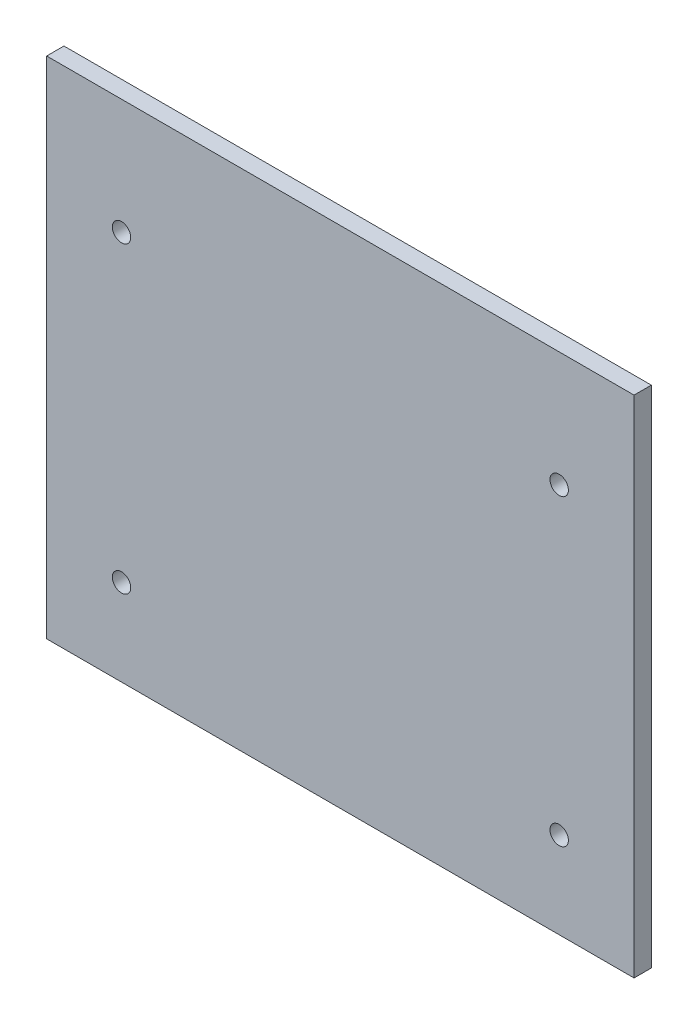
ISO-10303-21;
HEADER;
FILE_DESCRIPTION(('STEP AP214'),'2;1');
FILE_NAME('part.step','',(''),(''),'','','');
FILE_SCHEMA(('AUTOMOTIVE_DESIGN { 1 0 10303 214 1 1 1 1 }'));
ENDSEC;
DATA;
#1=APPLICATION_CONTEXT('core data for automotive mechanical design processes');
#2=APPLICATION_PROTOCOL_DEFINITION('international standard','automotive_design',2000,#1);
#3=PRODUCT_CONTEXT('',#1,'mechanical');
#4=PRODUCT('Part','Part','',(#3));
#5=PRODUCT_RELATED_PRODUCT_CATEGORY('part','',(#4));
#6=PRODUCT_DEFINITION_FORMATION('','',#4);
#7=PRODUCT_DEFINITION_CONTEXT('part definition',#1,'design');
#8=PRODUCT_DEFINITION('design','',#6,#7);
#9=PRODUCT_DEFINITION_SHAPE('','',#8);
#10=(LENGTH_UNIT() NAMED_UNIT(*) SI_UNIT(.MILLI.,.METRE.));
#11=(NAMED_UNIT(*) PLANE_ANGLE_UNIT() SI_UNIT($,.RADIAN.));
#12=(NAMED_UNIT(*) SI_UNIT($,.STERADIAN.) SOLID_ANGLE_UNIT());
#13=UNCERTAINTY_MEASURE_WITH_UNIT(LENGTH_MEASURE(1.E-05),#10,'distance_accuracy_value','');
#14=(GEOMETRIC_REPRESENTATION_CONTEXT(3) GLOBAL_UNCERTAINTY_ASSIGNED_CONTEXT((#13)) GLOBAL_UNIT_ASSIGNED_CONTEXT((#10,
#11,#12)) REPRESENTATION_CONTEXT('',''));
#15=CARTESIAN_POINT('',(0.,0.,0.));
#16=DIRECTION('',(0.,0.,1.));
#17=DIRECTION('',(1.,0.,0.));
#18=AXIS2_PLACEMENT_3D('',#15,#16,#17);
#19=CARTESIAN_POINT('',(0.,0.,3.));
#20=DIRECTION('',(0.,0.,-1.));
#21=DIRECTION('',(-1.,0.,0.));
#22=AXIS2_PLACEMENT_3D('',#19,#20,#21);
#23=PLANE('',#22);
#24=DIRECTION('',(0.,-1.,0.));
#25=VECTOR('',#24,1.);
#26=CARTESIAN_POINT('',(-51.0000000000033,-96.2227130691673,3.));
#27=LINE('',#26,#25);
#28=CARTESIAN_POINT('',(-51.0000000000033,-8.56074596825085,3.));
#29=VERTEX_POINT('',#28);
#30=CARTESIAN_POINT('',(-51.0000000000033,-96.2227130691673,3.));
#31=VERTEX_POINT('',#30);
#32=EDGE_CURVE('E97',#29,#31,#27,.T.);
#33=ORIENTED_EDGE('',*,*,#32,.T.);
#34=DIRECTION('',(1.,0.,0.));
#35=VECTOR('',#34,1.);
#36=CARTESIAN_POINT('',(-51.0000000000033,-96.2227130691673,3.));
#37=LINE('',#36,#35);
#38=CARTESIAN_POINT('',(51.0000000000086,-96.2227130691673,3.));
#39=VERTEX_POINT('',#38);
#40=EDGE_CURVE('E92',#31,#39,#37,.T.);
#41=ORIENTED_EDGE('',*,*,#40,.T.);
#42=DIRECTION('',(0.,1.,0.));
#43=VECTOR('',#42,1.);
#44=CARTESIAN_POINT('',(51.0000000000086,-96.2227130691673,3.));
#45=LINE('',#44,#43);
#46=CARTESIAN_POINT('',(51.0000000000086,-8.56074596825085,3.));
#47=VERTEX_POINT('',#46);
#48=EDGE_CURVE('E95',#39,#47,#45,.T.);
#49=ORIENTED_EDGE('',*,*,#48,.T.);
#50=DIRECTION('',(-1.,0.,0.));
#51=VECTOR('',#50,1.);
#52=CARTESIAN_POINT('',(-51.0000000000033,-8.56074596825085,3.));
#53=LINE('',#52,#51);
#54=EDGE_CURVE('E62',#47,#29,#53,.T.);
#55=ORIENTED_EDGE('',*,*,#54,.T.);
#56=EDGE_LOOP('',(#33,#41,#49,#55));
#57=FACE_BOUND('',#56,.T.);
#58=CARTESIAN_POINT('',(-37.999999999993,-81.222713069175,3.));
#59=DIRECTION('',(0.,0.,1.));
#60=DIRECTION('',(1.,0.,0.));
#61=AXIS2_PLACEMENT_3D('',#58,#59,#60);
#62=CIRCLE('',#61,1.60000000000001);
#63=CARTESIAN_POINT('',(-36.399999999993,-81.222713069175,3.));
#64=VERTEX_POINT('',#63);
#65=EDGE_CURVE('E112',#64,#64,#62,.T.);
#66=ORIENTED_EDGE('',*,*,#65,.F.);
#67=EDGE_LOOP('',(#66));
#68=FACE_BOUND('',#67,.T.);
#69=CARTESIAN_POINT('',(38.000000000026,-81.2227130691769,3.));
#70=DIRECTION('',(0.,0.,1.));
#71=DIRECTION('',(1.,0.,0.));
#72=AXIS2_PLACEMENT_3D('',#69,#70,#71);
#73=CIRCLE('',#72,1.59999999999998);
#74=CARTESIAN_POINT('',(39.600000000026,-81.2227130691769,3.));
#75=VERTEX_POINT('',#74);
#76=EDGE_CURVE('E127',#75,#75,#73,.T.);
#77=ORIENTED_EDGE('',*,*,#76,.F.);
#78=EDGE_LOOP('',(#77));
#79=FACE_BOUND('',#78,.T.);
#80=CARTESIAN_POINT('',(38.0000000000306,-28.5607459682607,3.));
#81=DIRECTION('',(0.,0.,1.));
#82=DIRECTION('',(1.,0.,0.));
#83=AXIS2_PLACEMENT_3D('',#80,#81,#82);
#84=CIRCLE('',#83,1.59999999999999);
#85=CARTESIAN_POINT('',(39.6000000000306,-28.5607459682607,3.));
#86=VERTEX_POINT('',#85);
#87=EDGE_CURVE('E133',#86,#86,#84,.T.);
#88=ORIENTED_EDGE('',*,*,#87,.F.);
#89=EDGE_LOOP('',(#88));
#90=FACE_BOUND('',#89,.T.);
#91=CARTESIAN_POINT('',(-37.9999999999942,-28.5607459682588,3.));
#92=DIRECTION('',(0.,0.,1.));
#93=DIRECTION('',(1.,0.,0.));
#94=AXIS2_PLACEMENT_3D('',#91,#92,#93);
#95=CIRCLE('',#94,1.6);
#96=CARTESIAN_POINT('',(-36.3999999999942,-28.5607459682588,3.));
#97=VERTEX_POINT('',#96);
#98=EDGE_CURVE('E139',#97,#97,#95,.T.);
#99=ORIENTED_EDGE('',*,*,#98,.F.);
#100=EDGE_LOOP('',(#99));
#101=FACE_BOUND('',#100,.T.);
#102=ADVANCED_FACE('F45',(#57,#68,#79,#90,#101),#23,.F.);
#103=CARTESIAN_POINT('',(0.,0.,0.));
#104=DIRECTION('',(0.,0.,-1.));
#105=DIRECTION('',(-1.,0.,0.));
#106=AXIS2_PLACEMENT_3D('',#103,#104,#105);
#107=PLANE('',#106);
#108=CARTESIAN_POINT('',(38.0000000000306,-28.5607459682607,0.));
#109=DIRECTION('',(0.,0.,1.));
#110=DIRECTION('',(1.,0.,0.));
#111=AXIS2_PLACEMENT_3D('',#108,#109,#110);
#112=CIRCLE('',#111,1.59999999999999);
#113=CARTESIAN_POINT('',(39.6000000000306,-28.5607459682607,0.));
#114=VERTEX_POINT('',#113);
#115=EDGE_CURVE('E136',#114,#114,#112,.T.);
#116=ORIENTED_EDGE('',*,*,#115,.T.);
#117=EDGE_LOOP('',(#116));
#118=FACE_BOUND('',#117,.T.);
#119=CARTESIAN_POINT('',(-37.999999999993,-81.222713069175,0.));
#120=DIRECTION('',(0.,0.,1.));
#121=DIRECTION('',(1.,0.,0.));
#122=AXIS2_PLACEMENT_3D('',#119,#120,#121);
#123=CIRCLE('',#122,1.60000000000001);
#124=CARTESIAN_POINT('',(-36.399999999993,-81.222713069175,0.));
#125=VERTEX_POINT('',#124);
#126=EDGE_CURVE('E124',#125,#125,#123,.T.);
#127=ORIENTED_EDGE('',*,*,#126,.T.);
#128=EDGE_LOOP('',(#127));
#129=FACE_BOUND('',#128,.T.);
#130=DIRECTION('',(0.,-1.,0.));
#131=VECTOR('',#130,1.);
#132=CARTESIAN_POINT('',(-51.0000000000033,-96.2227130691673,0.));
#133=LINE('',#132,#131);
#134=CARTESIAN_POINT('',(-51.0000000000033,-8.56074596825085,0.));
#135=VERTEX_POINT('',#134);
#136=CARTESIAN_POINT('',(-51.0000000000033,-96.2227130691673,0.));
#137=VERTEX_POINT('',#136);
#138=EDGE_CURVE('E109',#135,#137,#133,.T.);
#139=ORIENTED_EDGE('',*,*,#138,.F.);
#140=DIRECTION('',(-1.,0.,0.));
#141=VECTOR('',#140,1.);
#142=CARTESIAN_POINT('',(-51.0000000000033,-8.56074596825085,0.));
#143=LINE('',#142,#141);
#144=CARTESIAN_POINT('',(51.0000000000086,-8.56074596825085,0.));
#145=VERTEX_POINT('',#144);
#146=EDGE_CURVE('E85',#145,#135,#143,.T.);
#147=ORIENTED_EDGE('',*,*,#146,.F.);
#148=DIRECTION('',(0.,1.,0.));
#149=VECTOR('',#148,1.);
#150=CARTESIAN_POINT('',(51.0000000000086,-96.2227130691673,0.));
#151=LINE('',#150,#149);
#152=CARTESIAN_POINT('',(51.0000000000086,-96.2227130691673,0.));
#153=VERTEX_POINT('',#152);
#154=EDGE_CURVE('E79',#153,#145,#151,.T.);
#155=ORIENTED_EDGE('',*,*,#154,.F.);
#156=DIRECTION('',(1.,0.,0.));
#157=VECTOR('',#156,1.);
#158=CARTESIAN_POINT('',(-51.0000000000033,-96.2227130691673,0.));
#159=LINE('',#158,#157);
#160=EDGE_CURVE('E101',#137,#153,#159,.T.);
#161=ORIENTED_EDGE('',*,*,#160,.F.);
#162=EDGE_LOOP('',(#139,#147,#155,#161));
#163=FACE_BOUND('',#162,.T.);
#164=CARTESIAN_POINT('',(38.000000000026,-81.2227130691769,0.));
#165=DIRECTION('',(0.,0.,1.));
#166=DIRECTION('',(1.,0.,0.));
#167=AXIS2_PLACEMENT_3D('',#164,#165,#166);
#168=CIRCLE('',#167,1.59999999999998);
#169=CARTESIAN_POINT('',(39.600000000026,-81.2227130691769,0.));
#170=VERTEX_POINT('',#169);
#171=EDGE_CURVE('E130',#170,#170,#168,.T.);
#172=ORIENTED_EDGE('',*,*,#171,.T.);
#173=EDGE_LOOP('',(#172));
#174=FACE_BOUND('',#173,.T.);
#175=CARTESIAN_POINT('',(-37.9999999999942,-28.5607459682588,0.));
#176=DIRECTION('',(0.,0.,1.));
#177=DIRECTION('',(1.,0.,0.));
#178=AXIS2_PLACEMENT_3D('',#175,#176,#177);
#179=CIRCLE('',#178,1.6);
#180=CARTESIAN_POINT('',(-36.3999999999942,-28.5607459682588,0.));
#181=VERTEX_POINT('',#180);
#182=EDGE_CURVE('E142',#181,#181,#179,.T.);
#183=ORIENTED_EDGE('',*,*,#182,.T.);
#184=EDGE_LOOP('',(#183));
#185=FACE_BOUND('',#184,.T.);
#186=ADVANCED_FACE('F120',(#118,#129,#163,#174,#185),#107,.T.);
#187=CARTESIAN_POINT('',(-51.0000000000033,-96.2227130691673,3.));
#188=DIRECTION('',(1.,0.,0.));
#189=DIRECTION('',(0.,0.,-1.));
#190=AXIS2_PLACEMENT_3D('',#187,#188,#189);
#191=PLANE('',#190);
#192=ORIENTED_EDGE('',*,*,#138,.T.);
#193=DIRECTION('',(0.,0.,-1.));
#194=VECTOR('',#193,1.);
#195=CARTESIAN_POINT('',(-51.0000000000033,-96.2227130691673,3.));
#196=LINE('',#195,#194);
#197=EDGE_CURVE('E13',#31,#137,#196,.T.);
#198=ORIENTED_EDGE('',*,*,#197,.F.);
#199=ORIENTED_EDGE('',*,*,#32,.F.);
#200=DIRECTION('',(0.,0.,-1.));
#201=VECTOR('',#200,1.);
#202=CARTESIAN_POINT('',(-51.0000000000033,-8.56074596825085,3.));
#203=LINE('',#202,#201);
#204=EDGE_CURVE('E105',#29,#135,#203,.T.);
#205=ORIENTED_EDGE('',*,*,#204,.T.);
#206=EDGE_LOOP('',(#192,#198,#199,#205));
#207=FACE_BOUND('',#206,.T.);
#208=ADVANCED_FACE('F47',(#207),#191,.F.);
#209=CARTESIAN_POINT('',(-51.0000000000033,-96.2227130691673,3.));
#210=DIRECTION('',(0.,1.,0.));
#211=DIRECTION('',(0.,0.,1.));
#212=AXIS2_PLACEMENT_3D('',#209,#210,#211);
#213=PLANE('',#212);
#214=ORIENTED_EDGE('',*,*,#160,.T.);
#215=DIRECTION('',(0.,0.,-1.));
#216=VECTOR('',#215,1.);
#217=CARTESIAN_POINT('',(51.0000000000086,-96.2227130691673,3.));
#218=LINE('',#217,#216);
#219=EDGE_CURVE('E54',#39,#153,#218,.T.);
#220=ORIENTED_EDGE('',*,*,#219,.F.);
#221=ORIENTED_EDGE('',*,*,#40,.F.);
#222=ORIENTED_EDGE('',*,*,#197,.T.);
#223=EDGE_LOOP('',(#214,#220,#221,#222));
#224=FACE_BOUND('',#223,.T.);
#225=ADVANCED_FACE('F100',(#224),#213,.F.);
#226=CARTESIAN_POINT('',(51.0000000000086,-96.2227130691673,3.));
#227=DIRECTION('',(-1.,0.,0.));
#228=DIRECTION('',(0.,-1.,0.));
#229=AXIS2_PLACEMENT_3D('',#226,#227,#228);
#230=PLANE('',#229);
#231=ORIENTED_EDGE('',*,*,#154,.T.);
#232=DIRECTION('',(0.,0.,-1.));
#233=VECTOR('',#232,1.);
#234=CARTESIAN_POINT('',(51.0000000000086,-8.56074596825085,3.));
#235=LINE('',#234,#233);
#236=EDGE_CURVE('E102',#47,#145,#235,.T.);
#237=ORIENTED_EDGE('',*,*,#236,.F.);
#238=ORIENTED_EDGE('',*,*,#48,.F.);
#239=ORIENTED_EDGE('',*,*,#219,.T.);
#240=EDGE_LOOP('',(#231,#237,#238,#239));
#241=FACE_BOUND('',#240,.T.);
#242=ADVANCED_FACE('F103',(#241),#230,.F.);
#243=CARTESIAN_POINT('',(-51.0000000000033,-8.56074596825085,3.));
#244=DIRECTION('',(0.,-1.,0.));
#245=DIRECTION('',(1.,0.,0.));
#246=AXIS2_PLACEMENT_3D('',#243,#244,#245);
#247=PLANE('',#246);
#248=ORIENTED_EDGE('',*,*,#146,.T.);
#249=ORIENTED_EDGE('',*,*,#204,.F.);
#250=ORIENTED_EDGE('',*,*,#54,.F.);
#251=ORIENTED_EDGE('',*,*,#236,.T.);
#252=EDGE_LOOP('',(#248,#249,#250,#251));
#253=FACE_BOUND('',#252,.T.);
#254=ADVANCED_FACE('F117',(#253),#247,.F.);
#255=CARTESIAN_POINT('',(-37.999999999993,-81.222713069175,3.));
#256=DIRECTION('',(0.,0.,-1.));
#257=DIRECTION('',(-1.,0.,0.));
#258=AXIS2_PLACEMENT_3D('',#255,#256,#257);
#259=CYLINDRICAL_SURFACE('',#258,1.60000000000001);
#260=ORIENTED_EDGE('',*,*,#65,.T.);
#261=EDGE_LOOP('',(#260));
#262=FACE_BOUND('',#261,.T.);
#263=ORIENTED_EDGE('',*,*,#126,.F.);
#264=EDGE_LOOP('',(#263));
#265=FACE_BOUND('',#264,.T.);
#266=ADVANCED_FACE('F159',(#262,#265),#259,.F.);
#267=CARTESIAN_POINT('',(38.000000000026,-81.2227130691769,3.));
#268=DIRECTION('',(0.,0.,-1.));
#269=DIRECTION('',(-1.,0.,0.));
#270=AXIS2_PLACEMENT_3D('',#267,#268,#269);
#271=CYLINDRICAL_SURFACE('',#270,1.59999999999998);
#272=ORIENTED_EDGE('',*,*,#76,.T.);
#273=EDGE_LOOP('',(#272));
#274=FACE_BOUND('',#273,.T.);
#275=ORIENTED_EDGE('',*,*,#171,.F.);
#276=EDGE_LOOP('',(#275));
#277=FACE_BOUND('',#276,.T.);
#278=ADVANCED_FACE('F205',(#274,#277),#271,.F.);
#279=CARTESIAN_POINT('',(38.0000000000306,-28.5607459682607,3.));
#280=DIRECTION('',(0.,0.,-1.));
#281=DIRECTION('',(-1.,0.,0.));
#282=AXIS2_PLACEMENT_3D('',#279,#280,#281);
#283=CYLINDRICAL_SURFACE('',#282,1.59999999999999);
#284=ORIENTED_EDGE('',*,*,#87,.T.);
#285=EDGE_LOOP('',(#284));
#286=FACE_BOUND('',#285,.T.);
#287=ORIENTED_EDGE('',*,*,#115,.F.);
#288=EDGE_LOOP('',(#287));
#289=FACE_BOUND('',#288,.T.);
#290=ADVANCED_FACE('F213',(#286,#289),#283,.F.);
#291=CARTESIAN_POINT('',(-37.9999999999942,-28.5607459682588,3.));
#292=DIRECTION('',(0.,0.,-1.));
#293=DIRECTION('',(-1.,0.,0.));
#294=AXIS2_PLACEMENT_3D('',#291,#292,#293);
#295=CYLINDRICAL_SURFACE('',#294,1.6);
#296=ORIENTED_EDGE('',*,*,#98,.T.);
#297=EDGE_LOOP('',(#296));
#298=FACE_BOUND('',#297,.T.);
#299=ORIENTED_EDGE('',*,*,#182,.F.);
#300=EDGE_LOOP('',(#299));
#301=FACE_BOUND('',#300,.T.);
#302=ADVANCED_FACE('F148',(#298,#301),#295,.F.);
#303=CLOSED_SHELL('',(#102,#186,#208,#225,#242,#254,#266,#278,#290,#302));
#304=MANIFOLD_SOLID_BREP('B2',#303);
#305=ADVANCED_BREP_SHAPE_REPRESENTATION('',(#18,#304),#14);
#306=SHAPE_DEFINITION_REPRESENTATION(#9,#305);
ENDSEC;
END-ISO-10303-21;
